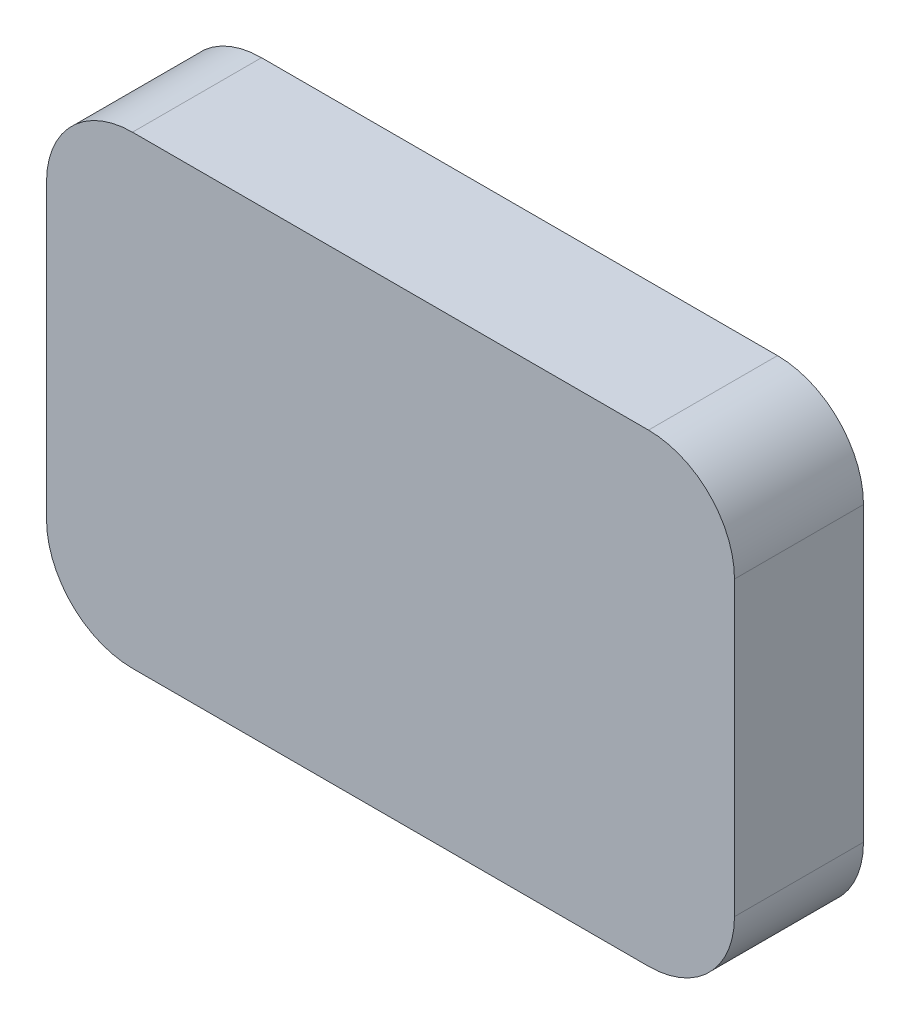
ISO-10303-21;
HEADER;
FILE_DESCRIPTION(('STEP AP214'),'2;1');
FILE_NAME('part.step','',(''),(''),'','','');
FILE_SCHEMA(('AUTOMOTIVE_DESIGN { 1 0 10303 214 1 1 1 1 }'));
ENDSEC;
DATA;
#1=APPLICATION_CONTEXT('core data for automotive mechanical design processes');
#2=APPLICATION_PROTOCOL_DEFINITION('international standard','automotive_design',2000,#1);
#3=PRODUCT_CONTEXT('',#1,'mechanical');
#4=PRODUCT('Part','Part','',(#3));
#5=PRODUCT_RELATED_PRODUCT_CATEGORY('part','',(#4));
#6=PRODUCT_DEFINITION_FORMATION('','',#4);
#7=PRODUCT_DEFINITION_CONTEXT('part definition',#1,'design');
#8=PRODUCT_DEFINITION('design','',#6,#7);
#9=PRODUCT_DEFINITION_SHAPE('','',#8);
#10=(LENGTH_UNIT() NAMED_UNIT(*) SI_UNIT(.MILLI.,.METRE.));
#11=(NAMED_UNIT(*) PLANE_ANGLE_UNIT() SI_UNIT($,.RADIAN.));
#12=(NAMED_UNIT(*) SI_UNIT($,.STERADIAN.) SOLID_ANGLE_UNIT());
#13=UNCERTAINTY_MEASURE_WITH_UNIT(LENGTH_MEASURE(1.E-05),#10,'distance_accuracy_value','');
#14=(GEOMETRIC_REPRESENTATION_CONTEXT(3) GLOBAL_UNCERTAINTY_ASSIGNED_CONTEXT((#13)) GLOBAL_UNIT_ASSIGNED_CONTEXT((#10,
#11,#12)) REPRESENTATION_CONTEXT('',''));
#15=CARTESIAN_POINT('',(0.,0.,0.));
#16=DIRECTION('',(0.,0.,1.));
#17=DIRECTION('',(1.,0.,0.));
#18=AXIS2_PLACEMENT_3D('',#15,#16,#17);
#19=CARTESIAN_POINT('',(0.,-54.,15.));
#20=DIRECTION('',(1.,0.,0.));
#21=DIRECTION('',(0.,1.,0.));
#22=AXIS2_PLACEMENT_3D('',#19,#20,#21);
#23=PLANE('',#22);
#24=DIRECTION('',(0.,-1.,0.));
#25=VECTOR('',#24,1.);
#26=CARTESIAN_POINT('',(0.,-54.,15.));
#27=LINE('',#26,#25);
#28=CARTESIAN_POINT('',(0.,-10.,15.));
#29=VERTEX_POINT('',#28);
#30=CARTESIAN_POINT('',(0.,-44.,15.));
#31=VERTEX_POINT('',#30);
#32=EDGE_CURVE('E129',#29,#31,#27,.T.);
#33=ORIENTED_EDGE('',*,*,#32,.F.);
#34=DIRECTION('',(0.,0.,-1.));
#35=VECTOR('',#34,1.);
#36=CARTESIAN_POINT('',(0.,-10.,15.));
#37=LINE('',#36,#35);
#38=CARTESIAN_POINT('',(0.,-10.,0.));
#39=VERTEX_POINT('',#38);
#40=EDGE_CURVE('E155',#29,#39,#37,.T.);
#41=ORIENTED_EDGE('',*,*,#40,.T.);
#42=DIRECTION('',(0.,-1.,0.));
#43=VECTOR('',#42,1.);
#44=CARTESIAN_POINT('',(0.,-54.,0.));
#45=LINE('',#44,#43);
#46=CARTESIAN_POINT('',(0.,-44.,0.));
#47=VERTEX_POINT('',#46);
#48=EDGE_CURVE('E161',#39,#47,#45,.T.);
#49=ORIENTED_EDGE('',*,*,#48,.T.);
#50=DIRECTION('',(0.,0.,-1.));
#51=VECTOR('',#50,1.);
#52=CARTESIAN_POINT('',(0.,-44.,15.));
#53=LINE('',#52,#51);
#54=EDGE_CURVE('E153',#47,#31,#53,.F.);
#55=ORIENTED_EDGE('',*,*,#54,.T.);
#56=EDGE_LOOP('',(#33,#41,#49,#55));
#57=FACE_BOUND('',#56,.T.);
#58=ADVANCED_FACE('F37',(#57),#23,.F.);
#59=CARTESIAN_POINT('',(80.,-54.,15.));
#60=DIRECTION('',(0.,1.,0.));
#61=DIRECTION('',(-1.,0.,0.));
#62=AXIS2_PLACEMENT_3D('',#59,#60,#61);
#63=PLANE('',#62);
#64=DIRECTION('',(1.,0.,0.));
#65=VECTOR('',#64,1.);
#66=CARTESIAN_POINT('',(80.,-54.,15.));
#67=LINE('',#66,#65);
#68=CARTESIAN_POINT('',(9.99999999999999,-54.,15.));
#69=VERTEX_POINT('',#68);
#70=CARTESIAN_POINT('',(70.,-54.,15.));
#71=VERTEX_POINT('',#70);
#72=EDGE_CURVE('E132',#69,#71,#67,.T.);
#73=ORIENTED_EDGE('',*,*,#72,.F.);
#74=DIRECTION('',(0.,0.,-1.));
#75=VECTOR('',#74,1.);
#76=CARTESIAN_POINT('',(9.99999999999999,-54.,15.));
#77=LINE('',#76,#75);
#78=CARTESIAN_POINT('',(9.99999999999999,-54.,0.));
#79=VERTEX_POINT('',#78);
#80=EDGE_CURVE('E11',#69,#79,#77,.T.);
#81=ORIENTED_EDGE('',*,*,#80,.T.);
#82=DIRECTION('',(1.,0.,0.));
#83=VECTOR('',#82,1.);
#84=CARTESIAN_POINT('',(80.,-54.,0.));
#85=LINE('',#84,#83);
#86=CARTESIAN_POINT('',(70.,-54.,0.));
#87=VERTEX_POINT('',#86);
#88=EDGE_CURVE('E134',#79,#87,#85,.T.);
#89=ORIENTED_EDGE('',*,*,#88,.T.);
#90=DIRECTION('',(0.,0.,-1.));
#91=VECTOR('',#90,1.);
#92=CARTESIAN_POINT('',(70.,-54.,15.));
#93=LINE('',#92,#91);
#94=EDGE_CURVE('E45',#87,#71,#93,.F.);
#95=ORIENTED_EDGE('',*,*,#94,.T.);
#96=EDGE_LOOP('',(#73,#81,#89,#95));
#97=FACE_BOUND('',#96,.T.);
#98=ADVANCED_FACE('F180',(#97),#63,.F.);
#99=CARTESIAN_POINT('',(80.,0.,15.));
#100=DIRECTION('',(-1.,0.,0.));
#101=DIRECTION('',(0.,-1.,0.));
#102=AXIS2_PLACEMENT_3D('',#99,#100,#101);
#103=PLANE('',#102);
#104=DIRECTION('',(0.,1.,0.));
#105=VECTOR('',#104,1.);
#106=CARTESIAN_POINT('',(80.,0.,0.));
#107=LINE('',#106,#105);
#108=CARTESIAN_POINT('',(80.,-44.,0.));
#109=VERTEX_POINT('',#108);
#110=CARTESIAN_POINT('',(80.,-10.,0.));
#111=VERTEX_POINT('',#110);
#112=EDGE_CURVE('E130',#109,#111,#107,.T.);
#113=ORIENTED_EDGE('',*,*,#112,.T.);
#114=DIRECTION('',(0.,0.,-1.));
#115=VECTOR('',#114,1.);
#116=CARTESIAN_POINT('',(80.,-10.,15.));
#117=LINE('',#116,#115);
#118=CARTESIAN_POINT('',(80.,-10.,15.));
#119=VERTEX_POINT('',#118);
#120=EDGE_CURVE('E108',#111,#119,#117,.F.);
#121=ORIENTED_EDGE('',*,*,#120,.T.);
#122=DIRECTION('',(0.,1.,0.));
#123=VECTOR('',#122,1.);
#124=CARTESIAN_POINT('',(80.,0.,15.));
#125=LINE('',#124,#123);
#126=CARTESIAN_POINT('',(80.,-44.,15.));
#127=VERTEX_POINT('',#126);
#128=EDGE_CURVE('E169',#127,#119,#125,.T.);
#129=ORIENTED_EDGE('',*,*,#128,.F.);
#130=DIRECTION('',(0.,0.,-1.));
#131=VECTOR('',#130,1.);
#132=CARTESIAN_POINT('',(80.,-44.,15.));
#133=LINE('',#132,#131);
#134=EDGE_CURVE('E113',#127,#109,#133,.T.);
#135=ORIENTED_EDGE('',*,*,#134,.T.);
#136=EDGE_LOOP('',(#113,#121,#129,#135));
#137=FACE_BOUND('',#136,.T.);
#138=ADVANCED_FACE('F179',(#137),#103,.F.);
#139=CARTESIAN_POINT('',(0.,0.,15.));
#140=DIRECTION('',(0.,-1.,0.));
#141=DIRECTION('',(0.,0.,-1.));
#142=AXIS2_PLACEMENT_3D('',#139,#140,#141);
#143=PLANE('',#142);
#144=DIRECTION('',(-1.,0.,0.));
#145=VECTOR('',#144,1.);
#146=CARTESIAN_POINT('',(0.,0.,15.));
#147=LINE('',#146,#145);
#148=CARTESIAN_POINT('',(70.,0.,15.));
#149=VERTEX_POINT('',#148);
#150=CARTESIAN_POINT('',(10.,0.,15.));
#151=VERTEX_POINT('',#150);
#152=EDGE_CURVE('E123',#149,#151,#147,.T.);
#153=ORIENTED_EDGE('',*,*,#152,.F.);
#154=DIRECTION('',(0.,0.,-1.));
#155=VECTOR('',#154,1.);
#156=CARTESIAN_POINT('',(70.,0.,15.));
#157=LINE('',#156,#155);
#158=CARTESIAN_POINT('',(70.,0.,0.));
#159=VERTEX_POINT('',#158);
#160=EDGE_CURVE('E107',#149,#159,#157,.T.);
#161=ORIENTED_EDGE('',*,*,#160,.T.);
#162=DIRECTION('',(-1.,0.,0.));
#163=VECTOR('',#162,1.);
#164=CARTESIAN_POINT('',(0.,0.,0.));
#165=LINE('',#164,#163);
#166=CARTESIAN_POINT('',(10.,0.,0.));
#167=VERTEX_POINT('',#166);
#168=EDGE_CURVE('E120',#159,#167,#165,.T.);
#169=ORIENTED_EDGE('',*,*,#168,.T.);
#170=DIRECTION('',(0.,0.,-1.));
#171=VECTOR('',#170,1.);
#172=CARTESIAN_POINT('',(10.,0.,15.));
#173=LINE('',#172,#171);
#174=EDGE_CURVE('E125',#167,#151,#173,.F.);
#175=ORIENTED_EDGE('',*,*,#174,.T.);
#176=EDGE_LOOP('',(#153,#161,#169,#175));
#177=FACE_BOUND('',#176,.T.);
#178=ADVANCED_FACE('F119',(#177),#143,.F.);
#179=CARTESIAN_POINT('',(0.,0.,15.));
#180=DIRECTION('',(0.,0.,-1.));
#181=DIRECTION('',(-1.,0.,0.));
#182=AXIS2_PLACEMENT_3D('',#179,#180,#181);
#183=PLANE('',#182);
#184=ORIENTED_EDGE('',*,*,#128,.T.);
#185=CARTESIAN_POINT('',(70.,-10.,15.));
#186=DIRECTION('',(0.,0.,-1.));
#187=DIRECTION('',(-1.,0.,0.));
#188=AXIS2_PLACEMENT_3D('',#185,#186,#187);
#189=CIRCLE('',#188,10.);
#190=EDGE_CURVE('E151',#119,#149,#189,.F.);
#191=ORIENTED_EDGE('',*,*,#190,.T.);
#192=ORIENTED_EDGE('',*,*,#152,.T.);
#193=CARTESIAN_POINT('',(10.,-10.,15.));
#194=DIRECTION('',(0.,0.,-1.));
#195=DIRECTION('',(-1.,0.,0.));
#196=AXIS2_PLACEMENT_3D('',#193,#194,#195);
#197=CIRCLE('',#196,10.);
#198=EDGE_CURVE('E149',#151,#29,#197,.F.);
#199=ORIENTED_EDGE('',*,*,#198,.T.);
#200=ORIENTED_EDGE('',*,*,#32,.T.);
#201=CARTESIAN_POINT('',(9.99999999999999,-44.,15.));
#202=DIRECTION('',(0.,0.,-1.));
#203=DIRECTION('',(-1.,0.,0.));
#204=AXIS2_PLACEMENT_3D('',#201,#202,#203);
#205=CIRCLE('',#204,10.);
#206=EDGE_CURVE('E58',#31,#69,#205,.F.);
#207=ORIENTED_EDGE('',*,*,#206,.T.);
#208=ORIENTED_EDGE('',*,*,#72,.T.);
#209=CARTESIAN_POINT('',(70.,-44.,15.));
#210=DIRECTION('',(0.,0.,-1.));
#211=DIRECTION('',(-1.,0.,0.));
#212=AXIS2_PLACEMENT_3D('',#209,#210,#211);
#213=CIRCLE('',#212,10.);
#214=EDGE_CURVE('E146',#71,#127,#213,.F.);
#215=ORIENTED_EDGE('',*,*,#214,.T.);
#216=EDGE_LOOP('',(#184,#191,#192,#199,#200,#207,#208,#215));
#217=FACE_BOUND('',#216,.T.);
#218=ADVANCED_FACE('F173',(#217),#183,.F.);
#219=CARTESIAN_POINT('',(0.,0.,0.));
#220=DIRECTION('',(0.,0.,-1.));
#221=DIRECTION('',(-1.,0.,0.));
#222=AXIS2_PLACEMENT_3D('',#219,#220,#221);
#223=PLANE('',#222);
#224=ORIENTED_EDGE('',*,*,#168,.F.);
#225=CARTESIAN_POINT('',(70.,-10.,0.));
#226=DIRECTION('',(0.,0.,-1.));
#227=DIRECTION('',(-1.,0.,0.));
#228=AXIS2_PLACEMENT_3D('',#225,#226,#227);
#229=CIRCLE('',#228,10.);
#230=EDGE_CURVE('E103',#159,#111,#229,.T.);
#231=ORIENTED_EDGE('',*,*,#230,.T.);
#232=ORIENTED_EDGE('',*,*,#112,.F.);
#233=CARTESIAN_POINT('',(70.,-44.,0.));
#234=DIRECTION('',(0.,0.,-1.));
#235=DIRECTION('',(-1.,0.,0.));
#236=AXIS2_PLACEMENT_3D('',#233,#234,#235);
#237=CIRCLE('',#236,10.);
#238=EDGE_CURVE('E124',#109,#87,#237,.T.);
#239=ORIENTED_EDGE('',*,*,#238,.T.);
#240=ORIENTED_EDGE('',*,*,#88,.F.);
#241=CARTESIAN_POINT('',(9.99999999999999,-44.,0.));
#242=DIRECTION('',(0.,0.,-1.));
#243=DIRECTION('',(-1.,0.,0.));
#244=AXIS2_PLACEMENT_3D('',#241,#242,#243);
#245=CIRCLE('',#244,10.);
#246=EDGE_CURVE('E140',#79,#47,#245,.T.);
#247=ORIENTED_EDGE('',*,*,#246,.T.);
#248=ORIENTED_EDGE('',*,*,#48,.F.);
#249=CARTESIAN_POINT('',(10.,-10.,0.));
#250=DIRECTION('',(0.,0.,-1.));
#251=DIRECTION('',(-1.,0.,0.));
#252=AXIS2_PLACEMENT_3D('',#249,#250,#251);
#253=CIRCLE('',#252,10.);
#254=EDGE_CURVE('E114',#39,#167,#253,.T.);
#255=ORIENTED_EDGE('',*,*,#254,.T.);
#256=EDGE_LOOP('',(#224,#231,#232,#239,#240,#247,#248,#255));
#257=FACE_BOUND('',#256,.T.);
#258=ADVANCED_FACE('F127',(#257),#223,.T.);
#259=CARTESIAN_POINT('',(70.,-10.,15.));
#260=DIRECTION('',(0.,0.,-1.));
#261=DIRECTION('',(-1.,0.,0.));
#262=AXIS2_PLACEMENT_3D('',#259,#260,#261);
#263=CYLINDRICAL_SURFACE('',#262,10.);
#264=ORIENTED_EDGE('',*,*,#190,.F.);
#265=ORIENTED_EDGE('',*,*,#120,.F.);
#266=ORIENTED_EDGE('',*,*,#230,.F.);
#267=ORIENTED_EDGE('',*,*,#160,.F.);
#268=EDGE_LOOP('',(#264,#265,#266,#267));
#269=FACE_BOUND('',#268,.T.);
#270=ADVANCED_FACE('F106',(#269),#263,.T.);
#271=CARTESIAN_POINT('',(10.,-10.,15.));
#272=DIRECTION('',(0.,0.,-1.));
#273=DIRECTION('',(-1.,0.,0.));
#274=AXIS2_PLACEMENT_3D('',#271,#272,#273);
#275=CYLINDRICAL_SURFACE('',#274,10.);
#276=ORIENTED_EDGE('',*,*,#198,.F.);
#277=ORIENTED_EDGE('',*,*,#174,.F.);
#278=ORIENTED_EDGE('',*,*,#254,.F.);
#279=ORIENTED_EDGE('',*,*,#40,.F.);
#280=EDGE_LOOP('',(#276,#277,#278,#279));
#281=FACE_BOUND('',#280,.T.);
#282=ADVANCED_FACE('F183',(#281),#275,.T.);
#283=CARTESIAN_POINT('',(9.99999999999999,-44.,15.));
#284=DIRECTION('',(0.,0.,-1.));
#285=DIRECTION('',(-1.,0.,0.));
#286=AXIS2_PLACEMENT_3D('',#283,#284,#285);
#287=CYLINDRICAL_SURFACE('',#286,10.);
#288=ORIENTED_EDGE('',*,*,#206,.F.);
#289=ORIENTED_EDGE('',*,*,#54,.F.);
#290=ORIENTED_EDGE('',*,*,#246,.F.);
#291=ORIENTED_EDGE('',*,*,#80,.F.);
#292=EDGE_LOOP('',(#288,#289,#290,#291));
#293=FACE_BOUND('',#292,.T.);
#294=ADVANCED_FACE('F182',(#293),#287,.T.);
#295=CARTESIAN_POINT('',(70.,-44.,15.));
#296=DIRECTION('',(0.,0.,-1.));
#297=DIRECTION('',(-1.,0.,0.));
#298=AXIS2_PLACEMENT_3D('',#295,#296,#297);
#299=CYLINDRICAL_SURFACE('',#298,10.);
#300=ORIENTED_EDGE('',*,*,#214,.F.);
#301=ORIENTED_EDGE('',*,*,#94,.F.);
#302=ORIENTED_EDGE('',*,*,#238,.F.);
#303=ORIENTED_EDGE('',*,*,#134,.F.);
#304=EDGE_LOOP('',(#300,#301,#302,#303));
#305=FACE_BOUND('',#304,.T.);
#306=ADVANCED_FACE('F39',(#305),#299,.T.);
#307=CLOSED_SHELL('',(#58,#98,#138,#178,#218,#258,#270,#282,#294,#306));
#308=MANIFOLD_SOLID_BREP('B2',#307);
#309=ADVANCED_BREP_SHAPE_REPRESENTATION('',(#18,#308),#14);
#310=SHAPE_DEFINITION_REPRESENTATION(#9,#309);
ENDSEC;
END-ISO-10303-21;
